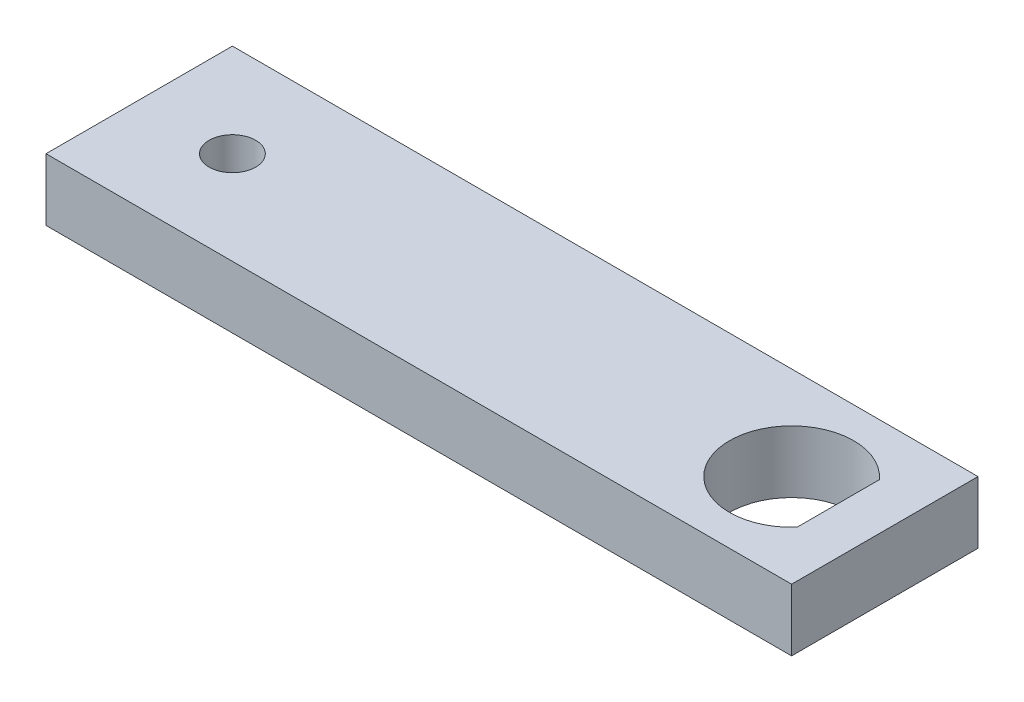
ISO-10303-21;
HEADER;
FILE_DESCRIPTION(('STEP AP214'),'2;1');
FILE_NAME('part.step','',(''),(''),'','','');
FILE_SCHEMA(('AUTOMOTIVE_DESIGN { 1 0 10303 214 1 1 1 1 }'));
ENDSEC;
DATA;
#1=APPLICATION_CONTEXT('core data for automotive mechanical design processes');
#2=APPLICATION_PROTOCOL_DEFINITION('international standard','automotive_design',2000,#1);
#3=PRODUCT_CONTEXT('',#1,'mechanical');
#4=PRODUCT('Part','Part','',(#3));
#5=PRODUCT_RELATED_PRODUCT_CATEGORY('part','',(#4));
#6=PRODUCT_DEFINITION_FORMATION('','',#4);
#7=PRODUCT_DEFINITION_CONTEXT('part definition',#1,'design');
#8=PRODUCT_DEFINITION('design','',#6,#7);
#9=PRODUCT_DEFINITION_SHAPE('','',#8);
#10=(LENGTH_UNIT() NAMED_UNIT(*) SI_UNIT(.MILLI.,.METRE.));
#11=(NAMED_UNIT(*) PLANE_ANGLE_UNIT() SI_UNIT($,.RADIAN.));
#12=(NAMED_UNIT(*) SI_UNIT($,.STERADIAN.) SOLID_ANGLE_UNIT());
#13=UNCERTAINTY_MEASURE_WITH_UNIT(LENGTH_MEASURE(1.E-05),#10,'distance_accuracy_value','');
#14=(GEOMETRIC_REPRESENTATION_CONTEXT(3) GLOBAL_UNCERTAINTY_ASSIGNED_CONTEXT((#13)) GLOBAL_UNIT_ASSIGNED_CONTEXT((#10,
#11,#12)) REPRESENTATION_CONTEXT('',''));
#15=CARTESIAN_POINT('',(0.,0.,0.));
#16=DIRECTION('',(0.,0.,1.));
#17=DIRECTION('',(1.,0.,0.));
#18=AXIS2_PLACEMENT_3D('',#15,#16,#17);
#19=CARTESIAN_POINT('',(0.,0.,19.05));
#20=DIRECTION('',(-1.,0.,0.));
#21=DIRECTION('',(0.,0.,1.));
#22=AXIS2_PLACEMENT_3D('',#19,#20,#21);
#23=PLANE('',#22);
#24=DIRECTION('',(0.,1.,0.));
#25=VECTOR('',#24,1.);
#26=CARTESIAN_POINT('',(0.,0.,0.));
#27=LINE('',#26,#25);
#28=CARTESIAN_POINT('',(0.,0.,0.));
#29=VERTEX_POINT('',#28);
#30=CARTESIAN_POINT('',(0.,6.35000000000001,0.));
#31=VERTEX_POINT('',#30);
#32=EDGE_CURVE('E107',#29,#31,#27,.T.);
#33=ORIENTED_EDGE('',*,*,#32,.F.);
#34=DIRECTION('',(0.,0.,-1.));
#35=VECTOR('',#34,1.);
#36=CARTESIAN_POINT('',(0.,0.,19.05));
#37=LINE('',#36,#35);
#38=CARTESIAN_POINT('',(0.,0.,19.05));
#39=VERTEX_POINT('',#38);
#40=EDGE_CURVE('E11',#39,#29,#37,.T.);
#41=ORIENTED_EDGE('',*,*,#40,.F.);
#42=DIRECTION('',(0.,1.,0.));
#43=VECTOR('',#42,1.);
#44=CARTESIAN_POINT('',(0.,0.,19.05));
#45=LINE('',#44,#43);
#46=CARTESIAN_POINT('',(0.,6.35000000000001,19.05));
#47=VERTEX_POINT('',#46);
#48=EDGE_CURVE('E109',#39,#47,#45,.T.);
#49=ORIENTED_EDGE('',*,*,#48,.T.);
#50=DIRECTION('',(0.,0.,-1.));
#51=VECTOR('',#50,1.);
#52=CARTESIAN_POINT('',(0.,6.35000000000001,19.05));
#53=LINE('',#52,#51);
#54=EDGE_CURVE('E37',#47,#31,#53,.T.);
#55=ORIENTED_EDGE('',*,*,#54,.T.);
#56=EDGE_LOOP('',(#33,#41,#49,#55));
#57=FACE_BOUND('',#56,.T.);
#58=ADVANCED_FACE('F34',(#57),#23,.T.);
#59=CARTESIAN_POINT('',(0.,0.,19.05));
#60=DIRECTION('',(0.,1.,0.));
#61=DIRECTION('',(-1.,0.,0.));
#62=AXIS2_PLACEMENT_3D('',#59,#60,#61);
#63=PLANE('',#62);
#64=CARTESIAN_POINT('',(9.525,0.,9.525));
#65=DIRECTION('',(0.,1.,0.));
#66=DIRECTION('',(-1.,0.,0.));
#67=AXIS2_PLACEMENT_3D('',#64,#65,#66);
#68=CIRCLE('',#67,2.38125);
#69=CARTESIAN_POINT('',(7.14375,0.,9.525));
#70=VERTEX_POINT('',#69);
#71=EDGE_CURVE('E105',#70,#70,#68,.T.);
#72=ORIENTED_EDGE('',*,*,#71,.T.);
#73=EDGE_LOOP('',(#72));
#74=FACE_BOUND('',#73,.T.);
#75=DIRECTION('',(0.,0.,1.));
#76=VECTOR('',#75,1.);
#77=CARTESIAN_POINT('',(71.4375,0.,5.32486979368498));
#78=LINE('',#77,#76);
#79=CARTESIAN_POINT('',(71.4375,0.,5.32486979368498));
#80=VERTEX_POINT('',#79);
#81=CARTESIAN_POINT('',(71.4375,0.,13.725130206315));
#82=VERTEX_POINT('',#81);
#83=EDGE_CURVE('E86',#80,#82,#78,.T.);
#84=ORIENTED_EDGE('',*,*,#83,.F.);
#85=CARTESIAN_POINT('',(66.675,0.,9.525));
#86=DIRECTION('',(0.,1.,0.));
#87=DIRECTION('',(-1.,0.,0.));
#88=AXIS2_PLACEMENT_3D('',#85,#86,#87);
#89=CIRCLE('',#88,6.35);
#90=EDGE_CURVE('E50',#80,#82,#89,.T.);
#91=ORIENTED_EDGE('',*,*,#90,.T.);
#92=EDGE_LOOP('',(#84,#91));
#93=FACE_BOUND('',#92,.T.);
#94=DIRECTION('',(1.,0.,0.));
#95=VECTOR('',#94,1.);
#96=CARTESIAN_POINT('',(0.,0.,0.));
#97=LINE('',#96,#95);
#98=CARTESIAN_POINT('',(76.2,0.,0.));
#99=VERTEX_POINT('',#98);
#100=EDGE_CURVE('E113',#29,#99,#97,.T.);
#101=ORIENTED_EDGE('',*,*,#100,.T.);
#102=DIRECTION('',(0.,0.,-1.));
#103=VECTOR('',#102,1.);
#104=CARTESIAN_POINT('',(76.2,0.,19.05));
#105=LINE('',#104,#103);
#106=CARTESIAN_POINT('',(76.2,0.,19.05));
#107=VERTEX_POINT('',#106);
#108=EDGE_CURVE('E42',#107,#99,#105,.T.);
#109=ORIENTED_EDGE('',*,*,#108,.F.);
#110=DIRECTION('',(1.,0.,0.));
#111=VECTOR('',#110,1.);
#112=CARTESIAN_POINT('',(0.,0.,19.05));
#113=LINE('',#112,#111);
#114=EDGE_CURVE('E118',#39,#107,#113,.T.);
#115=ORIENTED_EDGE('',*,*,#114,.F.);
#116=ORIENTED_EDGE('',*,*,#40,.T.);
#117=EDGE_LOOP('',(#101,#109,#115,#116));
#118=FACE_BOUND('',#117,.T.);
#119=ADVANCED_FACE('F96',(#74,#93,#118),#63,.F.);
#120=CARTESIAN_POINT('',(76.2,6.35,19.05));
#121=DIRECTION('',(1.,0.,0.));
#122=DIRECTION('',(0.,0.,-1.));
#123=AXIS2_PLACEMENT_3D('',#120,#121,#122);
#124=PLANE('',#123);
#125=DIRECTION('',(0.,-1.,0.));
#126=VECTOR('',#125,1.);
#127=CARTESIAN_POINT('',(76.2,6.35,0.));
#128=LINE('',#127,#126);
#129=CARTESIAN_POINT('',(76.2,6.35,0.));
#130=VERTEX_POINT('',#129);
#131=EDGE_CURVE('E125',#130,#99,#128,.T.);
#132=ORIENTED_EDGE('',*,*,#131,.F.);
#133=DIRECTION('',(0.,0.,-1.));
#134=VECTOR('',#133,1.);
#135=CARTESIAN_POINT('',(76.2,6.35,19.05));
#136=LINE('',#135,#134);
#137=CARTESIAN_POINT('',(76.2,6.35,19.05));
#138=VERTEX_POINT('',#137);
#139=EDGE_CURVE('E131',#138,#130,#136,.T.);
#140=ORIENTED_EDGE('',*,*,#139,.F.);
#141=DIRECTION('',(0.,-1.,0.));
#142=VECTOR('',#141,1.);
#143=CARTESIAN_POINT('',(76.2,6.35,19.05));
#144=LINE('',#143,#142);
#145=EDGE_CURVE('E115',#138,#107,#144,.T.);
#146=ORIENTED_EDGE('',*,*,#145,.T.);
#147=ORIENTED_EDGE('',*,*,#108,.T.);
#148=EDGE_LOOP('',(#132,#140,#146,#147));
#149=FACE_BOUND('',#148,.T.);
#150=ADVANCED_FACE('F150',(#149),#124,.T.);
#151=CARTESIAN_POINT('',(76.2,6.35,19.05));
#152=DIRECTION('',(0.,-1.,0.));
#153=DIRECTION('',(1.,0.,0.));
#154=AXIS2_PLACEMENT_3D('',#151,#152,#153);
#155=PLANE('',#154);
#156=CARTESIAN_POINT('',(9.525,6.35000000000001,9.525));
#157=DIRECTION('',(0.,1.,0.));
#158=DIRECTION('',(-1.,0.,0.));
#159=AXIS2_PLACEMENT_3D('',#156,#157,#158);
#160=CIRCLE('',#159,2.38125);
#161=CARTESIAN_POINT('',(7.14375,6.35000000000001,9.525));
#162=VERTEX_POINT('',#161);
#163=EDGE_CURVE('E102',#162,#162,#160,.T.);
#164=ORIENTED_EDGE('',*,*,#163,.F.);
#165=EDGE_LOOP('',(#164));
#166=FACE_BOUND('',#165,.T.);
#167=DIRECTION('',(0.,0.,1.));
#168=VECTOR('',#167,1.);
#169=CARTESIAN_POINT('',(71.4375,6.35,5.32486979368498));
#170=LINE('',#169,#168);
#171=CARTESIAN_POINT('',(71.4375,6.35,5.32486979368498));
#172=VERTEX_POINT('',#171);
#173=CARTESIAN_POINT('',(71.4375,6.35,13.725130206315));
#174=VERTEX_POINT('',#173);
#175=EDGE_CURVE('E98',#172,#174,#170,.T.);
#176=ORIENTED_EDGE('',*,*,#175,.T.);
#177=CARTESIAN_POINT('',(66.675,6.35,9.525));
#178=DIRECTION('',(0.,1.,0.));
#179=DIRECTION('',(-1.,0.,0.));
#180=AXIS2_PLACEMENT_3D('',#177,#178,#179);
#181=CIRCLE('',#180,6.35);
#182=EDGE_CURVE('E55',#172,#174,#181,.T.);
#183=ORIENTED_EDGE('',*,*,#182,.F.);
#184=EDGE_LOOP('',(#176,#183));
#185=FACE_BOUND('',#184,.T.);
#186=DIRECTION('',(-1.,0.,0.));
#187=VECTOR('',#186,1.);
#188=CARTESIAN_POINT('',(76.2,6.35,0.));
#189=LINE('',#188,#187);
#190=EDGE_CURVE('E122',#130,#31,#189,.T.);
#191=ORIENTED_EDGE('',*,*,#190,.T.);
#192=ORIENTED_EDGE('',*,*,#54,.F.);
#193=DIRECTION('',(-1.,0.,0.));
#194=VECTOR('',#193,1.);
#195=CARTESIAN_POINT('',(76.2,6.35,19.05));
#196=LINE('',#195,#194);
#197=EDGE_CURVE('E112',#138,#47,#196,.T.);
#198=ORIENTED_EDGE('',*,*,#197,.F.);
#199=ORIENTED_EDGE('',*,*,#139,.T.);
#200=EDGE_LOOP('',(#191,#192,#198,#199));
#201=FACE_BOUND('',#200,.T.);
#202=ADVANCED_FACE('F139',(#166,#185,#201),#155,.F.);
#203=CARTESIAN_POINT('',(0.,0.,19.05));
#204=DIRECTION('',(0.,0.,-1.));
#205=DIRECTION('',(-1.,0.,0.));
#206=AXIS2_PLACEMENT_3D('',#203,#204,#205);
#207=PLANE('',#206);
#208=ORIENTED_EDGE('',*,*,#48,.F.);
#209=ORIENTED_EDGE('',*,*,#114,.T.);
#210=ORIENTED_EDGE('',*,*,#145,.F.);
#211=ORIENTED_EDGE('',*,*,#197,.T.);
#212=EDGE_LOOP('',(#208,#209,#210,#211));
#213=FACE_BOUND('',#212,.T.);
#214=ADVANCED_FACE('F148',(#213),#207,.F.);
#215=CARTESIAN_POINT('',(0.,0.,0.));
#216=DIRECTION('',(0.,0.,-1.));
#217=DIRECTION('',(-1.,0.,0.));
#218=AXIS2_PLACEMENT_3D('',#215,#216,#217);
#219=PLANE('',#218);
#220=ORIENTED_EDGE('',*,*,#32,.T.);
#221=ORIENTED_EDGE('',*,*,#190,.F.);
#222=ORIENTED_EDGE('',*,*,#131,.T.);
#223=ORIENTED_EDGE('',*,*,#100,.F.);
#224=EDGE_LOOP('',(#220,#221,#222,#223));
#225=FACE_BOUND('',#224,.T.);
#226=ADVANCED_FACE('F143',(#225),#219,.T.);
#227=CARTESIAN_POINT('',(66.675,0.,9.525));
#228=DIRECTION('',(0.,1.,0.));
#229=DIRECTION('',(-1.,0.,0.));
#230=AXIS2_PLACEMENT_3D('',#227,#228,#229);
#231=CYLINDRICAL_SURFACE('',#230,6.35);
#232=ORIENTED_EDGE('',*,*,#182,.T.);
#233=DIRECTION('',(0.,1.,0.));
#234=VECTOR('',#233,1.);
#235=CARTESIAN_POINT('',(71.4375,0.,13.725130206315));
#236=LINE('',#235,#234);
#237=EDGE_CURVE('E89',#82,#174,#236,.T.);
#238=ORIENTED_EDGE('',*,*,#237,.F.);
#239=ORIENTED_EDGE('',*,*,#90,.F.);
#240=DIRECTION('',(0.,1.,0.));
#241=VECTOR('',#240,1.);
#242=CARTESIAN_POINT('',(71.4375,0.,5.32486979368498));
#243=LINE('',#242,#241);
#244=EDGE_CURVE('E91',#80,#172,#243,.T.);
#245=ORIENTED_EDGE('',*,*,#244,.T.);
#246=EDGE_LOOP('',(#232,#238,#239,#245));
#247=FACE_BOUND('',#246,.T.);
#248=ADVANCED_FACE('F94',(#247),#231,.F.);
#249=CARTESIAN_POINT('',(71.4375,0.,5.32486979368498));
#250=DIRECTION('',(-1.,0.,0.));
#251=DIRECTION('',(0.,-1.,0.));
#252=AXIS2_PLACEMENT_3D('',#249,#250,#251);
#253=PLANE('',#252);
#254=ORIENTED_EDGE('',*,*,#175,.F.);
#255=ORIENTED_EDGE('',*,*,#244,.F.);
#256=ORIENTED_EDGE('',*,*,#83,.T.);
#257=ORIENTED_EDGE('',*,*,#237,.T.);
#258=EDGE_LOOP('',(#254,#255,#256,#257));
#259=FACE_BOUND('',#258,.T.);
#260=ADVANCED_FACE('F88',(#259),#253,.T.);
#261=CARTESIAN_POINT('',(9.525,0.,9.525));
#262=DIRECTION('',(0.,1.,0.));
#263=DIRECTION('',(-1.,0.,0.));
#264=AXIS2_PLACEMENT_3D('',#261,#262,#263);
#265=CYLINDRICAL_SURFACE('',#264,2.38125);
#266=CARTESIAN_POINT('',(7.14375,0.,9.525));
#267=CARTESIAN_POINT('',(7.14375,0.0661458333333243,9.525));
#268=CARTESIAN_POINT('',(7.14375,0.132291666666658,9.525));
#269=CARTESIAN_POINT('',(7.14375,0.264583333333325,9.525));
#270=CARTESIAN_POINT('',(7.14375,0.330729166666659,9.525));
#271=CARTESIAN_POINT('',(7.14375,0.463020833333326,9.525));
#272=CARTESIAN_POINT('',(7.14375,0.529166666666659,9.525));
#273=CARTESIAN_POINT('',(7.14375,0.661458333333326,9.525));
#274=CARTESIAN_POINT('',(7.14375,0.72760416666666,9.525));
#275=CARTESIAN_POINT('',(7.14375,0.859895833333327,9.525));
#276=CARTESIAN_POINT('',(7.14375,0.926041666666661,9.525));
#277=CARTESIAN_POINT('',(7.14375,1.05833333333333,9.525));
#278=CARTESIAN_POINT('',(7.14375,1.12447916666666,9.525));
#279=CARTESIAN_POINT('',(7.14375,1.25677083333333,9.525));
#280=CARTESIAN_POINT('',(7.14375,1.32291666666666,9.525));
#281=CARTESIAN_POINT('',(7.14375,1.45520833333333,9.525));
#282=CARTESIAN_POINT('',(7.14375,1.52135416666666,9.525));
#283=CARTESIAN_POINT('',(7.14375,1.65364583333333,9.525));
#284=CARTESIAN_POINT('',(7.14375,1.71979166666666,9.525));
#285=CARTESIAN_POINT('',(7.14375,1.85208333333333,9.525));
#286=CARTESIAN_POINT('',(7.14375,1.91822916666666,9.525));
#287=CARTESIAN_POINT('',(7.14375,2.05052083333333,9.525));
#288=CARTESIAN_POINT('',(7.14375,2.11666666666666,9.525));
#289=CARTESIAN_POINT('',(7.14375,2.24895833333333,9.525));
#290=CARTESIAN_POINT('',(7.14375,2.31510416666667,9.525));
#291=CARTESIAN_POINT('',(7.14375,2.44739583333333,9.525));
#292=CARTESIAN_POINT('',(7.14375,2.51354166666667,9.525));
#293=CARTESIAN_POINT('',(7.14375,2.64583333333333,9.525));
#294=CARTESIAN_POINT('',(7.14375,2.71197916666667,9.525));
#295=CARTESIAN_POINT('',(7.14375,2.84427083333333,9.525));
#296=CARTESIAN_POINT('',(7.14375,2.91041666666667,9.525));
#297=CARTESIAN_POINT('',(7.14375,3.04270833333334,9.525));
#298=CARTESIAN_POINT('',(7.14375,3.10885416666667,9.525));
#299=CARTESIAN_POINT('',(7.14375,3.24114583333334,9.525));
#300=CARTESIAN_POINT('',(7.14375,3.30729166666667,9.525));
#301=CARTESIAN_POINT('',(7.14375,3.43958333333334,9.525));
#302=CARTESIAN_POINT('',(7.14375,3.50572916666667,9.525));
#303=CARTESIAN_POINT('',(7.14375,3.63802083333334,9.525));
#304=CARTESIAN_POINT('',(7.14375,3.70416666666667,9.525));
#305=CARTESIAN_POINT('',(7.14375,3.83645833333334,9.525));
#306=CARTESIAN_POINT('',(7.14375,3.90260416666667,9.525));
#307=CARTESIAN_POINT('',(7.14375,4.03489583333334,9.525));
#308=CARTESIAN_POINT('',(7.14375,4.10104166666667,9.525));
#309=CARTESIAN_POINT('',(7.14375,4.23333333333334,9.525));
#310=CARTESIAN_POINT('',(7.14375,4.29947916666667,9.525));
#311=CARTESIAN_POINT('',(7.14375,4.43177083333334,9.525));
#312=CARTESIAN_POINT('',(7.14375,4.49791666666667,9.525));
#313=CARTESIAN_POINT('',(7.14375,4.63020833333334,9.525));
#314=CARTESIAN_POINT('',(7.14375,4.69635416666667,9.525));
#315=CARTESIAN_POINT('',(7.14375,4.82864583333334,9.525));
#316=CARTESIAN_POINT('',(7.14375,4.89479166666668,9.525));
#317=CARTESIAN_POINT('',(7.14375,5.02708333333334,9.525));
#318=CARTESIAN_POINT('',(7.14375,5.09322916666668,9.525));
#319=CARTESIAN_POINT('',(7.14375,5.22552083333334,9.525));
#320=CARTESIAN_POINT('',(7.14375,5.29166666666668,9.525));
#321=CARTESIAN_POINT('',(7.14375,5.42395833333334,9.525));
#322=CARTESIAN_POINT('',(7.14375,5.49010416666668,9.525));
#323=CARTESIAN_POINT('',(7.14375,5.62239583333334,9.525));
#324=CARTESIAN_POINT('',(7.14375,5.68854166666668,9.525));
#325=CARTESIAN_POINT('',(7.14375,5.82083333333335,9.525));
#326=CARTESIAN_POINT('',(7.14375,5.88697916666668,9.525));
#327=CARTESIAN_POINT('',(7.14375,6.01927083333335,9.525));
#328=CARTESIAN_POINT('',(7.14375,6.08541666666668,9.525));
#329=CARTESIAN_POINT('',(7.14375,6.21770833333335,9.525));
#330=CARTESIAN_POINT('',(7.14375,6.28385416666668,9.525));
#331=CARTESIAN_POINT('',(7.14375,6.35000000000001,9.525));
#332=B_SPLINE_CURVE_WITH_KNOTS('',3,(#266,#267,#268,#269,#270,#271,#272,#273,#274,#275,#276,
#277,#278,#279,#280,#281,#282,#283,#284,#285,#286,#287,#288,#289,#290,#291,#292,#293,#294,#295,
#296,#297,#298,#299,#300,#301,#302,#303,#304,#305,#306,#307,#308,#309,#310,#311,#312,#313,#314,
#315,#316,#317,#318,#319,#320,#321,#322,#323,#324,#325,#326,#327,#328,#329,#330,#331),
.UNSPECIFIED.,.F.,.F.,(4,2,2,2,2,2,2,2,2,2,2,2,2,2,2,2,2,2,2,2,2,2,2,2,2,2,2,2,2,2,2,2,4),(0.,
0.198437500000001,0.396875000000001,0.595312500000002,0.793750000000003,0.992187500000003,
1.190625,1.38906250000001,1.58750000000001,1.78593750000001,1.98437500000001,2.18281250000001,
2.38125000000001,2.57968750000001,2.77812500000001,2.97656250000001,3.17500000000001,
3.37343750000001,3.57187500000001,3.77031250000001,3.96875000000001,4.16718750000001,
4.36562500000002,4.56406250000002,4.76250000000002,4.96093750000002,5.15937500000002,
5.35781250000002,5.55625000000002,5.75468750000002,5.95312500000002,6.15156250000002,
6.35000000000002),.UNSPECIFIED.);
#333=EDGE_CURVE('BSEAM187',#70,#162,#332,.T.);
#334=ORIENTED_EDGE('',*,*,#71,.F.);
#335=ORIENTED_EDGE('',*,*,#163,.T.);
#336=ORIENTED_EDGE('',*,*,#333,.T.);
#337=ORIENTED_EDGE('',*,*,#333,.F.);
#338=EDGE_LOOP('',(#334,#336,#335,#337));
#339=FACE_BOUND('',#338,.T.);
#340=ADVANCED_FACE('F187',(#339),#265,.F.);
#341=CLOSED_SHELL('',(#58,#119,#150,#202,#214,#226,#248,#260,#340));
#342=MANIFOLD_SOLID_BREP('B2',#341);
#343=ADVANCED_BREP_SHAPE_REPRESENTATION('',(#18,#342),#14);
#344=SHAPE_DEFINITION_REPRESENTATION(#9,#343);
ENDSEC;
END-ISO-10303-21;
